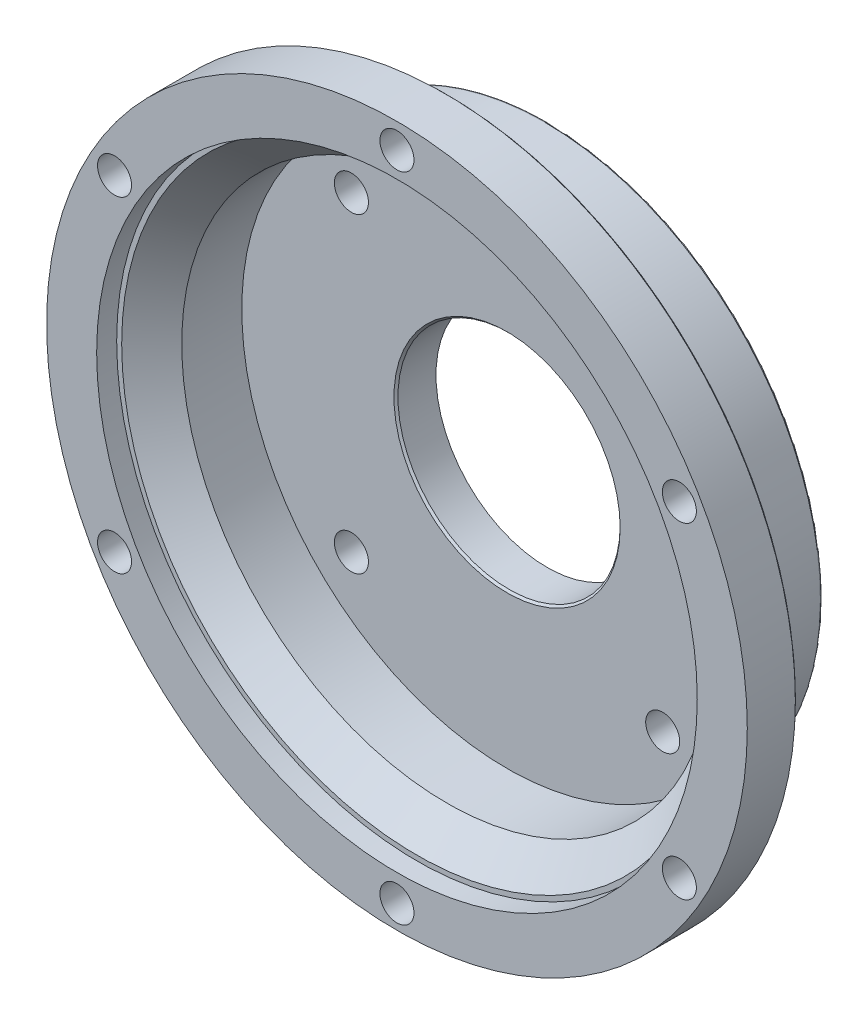
ISO-10303-21;
HEADER;
FILE_DESCRIPTION(('STEP AP214'),'2;1');
FILE_NAME('part.step','',(''),(''),'','','');
FILE_SCHEMA(('AUTOMOTIVE_DESIGN { 1 0 10303 214 1 1 1 1 }'));
ENDSEC;
DATA;
#1=APPLICATION_CONTEXT('core data for automotive mechanical design processes');
#2=APPLICATION_PROTOCOL_DEFINITION('international standard','automotive_design',2000,#1);
#3=PRODUCT_CONTEXT('',#1,'mechanical');
#4=PRODUCT('Part','Part','',(#3));
#5=PRODUCT_RELATED_PRODUCT_CATEGORY('part','',(#4));
#6=PRODUCT_DEFINITION_FORMATION('','',#4);
#7=PRODUCT_DEFINITION_CONTEXT('part definition',#1,'design');
#8=PRODUCT_DEFINITION('design','',#6,#7);
#9=PRODUCT_DEFINITION_SHAPE('','',#8);
#10=(LENGTH_UNIT() NAMED_UNIT(*) SI_UNIT(.MILLI.,.METRE.));
#11=(NAMED_UNIT(*) PLANE_ANGLE_UNIT() SI_UNIT($,.RADIAN.));
#12=(NAMED_UNIT(*) SI_UNIT($,.STERADIAN.) SOLID_ANGLE_UNIT());
#13=UNCERTAINTY_MEASURE_WITH_UNIT(LENGTH_MEASURE(1.E-05),#10,'distance_accuracy_value','');
#14=(GEOMETRIC_REPRESENTATION_CONTEXT(3) GLOBAL_UNCERTAINTY_ASSIGNED_CONTEXT((#13)) GLOBAL_UNIT_ASSIGNED_CONTEXT((#10,
#11,#12)) REPRESENTATION_CONTEXT('',''));
#15=CARTESIAN_POINT('',(0.,0.,0.));
#16=DIRECTION('',(0.,0.,1.));
#17=DIRECTION('',(1.,0.,0.));
#18=AXIS2_PLACEMENT_3D('',#15,#16,#17);
#19=CARTESIAN_POINT('',(-15.55,-15.55,2.99999999999999));
#20=DIRECTION('',(0.,0.,1.));
#21=DIRECTION('',(1.,0.,0.));
#22=AXIS2_PLACEMENT_3D('',#19,#20,#21);
#23=CYLINDRICAL_SURFACE('',#22,1.7);
#24=CARTESIAN_POINT('',(-15.55,-15.55,-10.));
#25=DIRECTION('',(0.,0.,1.));
#26=DIRECTION('',(1.,0.,0.));
#27=AXIS2_PLACEMENT_3D('',#24,#25,#26);
#28=CIRCLE('',#27,1.7);
#29=CARTESIAN_POINT('',(-13.85,-15.55,-10.));
#30=VERTEX_POINT('',#29);
#31=EDGE_CURVE('E106',#30,#30,#28,.T.);
#32=ORIENTED_EDGE('',*,*,#31,.F.);
#33=EDGE_LOOP('',(#32));
#34=FACE_BOUND('',#33,.T.);
#35=CARTESIAN_POINT('',(-15.55,-15.55,-6.00000000000001));
#36=DIRECTION('',(0.,0.,1.));
#37=DIRECTION('',(1.,0.,0.));
#38=AXIS2_PLACEMENT_3D('',#35,#36,#37);
#39=CIRCLE('',#38,1.7);
#40=CARTESIAN_POINT('',(-13.85,-15.55,-6.00000000000001));
#41=VERTEX_POINT('',#40);
#42=EDGE_CURVE('E136',#41,#41,#39,.F.);
#43=ORIENTED_EDGE('',*,*,#42,.F.);
#44=EDGE_LOOP('',(#43));
#45=FACE_BOUND('',#44,.T.);
#46=ADVANCED_FACE('F39',(#34,#45),#23,.F.);
#47=CARTESIAN_POINT('',(15.55,-15.55,2.99999999999999));
#48=DIRECTION('',(0.,0.,1.));
#49=DIRECTION('',(1.,0.,0.));
#50=AXIS2_PLACEMENT_3D('',#47,#48,#49);
#51=CYLINDRICAL_SURFACE('',#50,1.7);
#52=CARTESIAN_POINT('',(15.55,-15.55,-10.));
#53=DIRECTION('',(0.,0.,1.));
#54=DIRECTION('',(1.,0.,0.));
#55=AXIS2_PLACEMENT_3D('',#52,#53,#54);
#56=CIRCLE('',#55,1.7);
#57=CARTESIAN_POINT('',(17.25,-15.55,-10.));
#58=VERTEX_POINT('',#57);
#59=EDGE_CURVE('E111',#58,#58,#56,.T.);
#60=ORIENTED_EDGE('',*,*,#59,.F.);
#61=EDGE_LOOP('',(#60));
#62=FACE_BOUND('',#61,.T.);
#63=CARTESIAN_POINT('',(15.55,-15.55,-6.00000000000001));
#64=DIRECTION('',(0.,0.,1.));
#65=DIRECTION('',(1.,0.,0.));
#66=AXIS2_PLACEMENT_3D('',#63,#64,#65);
#67=CIRCLE('',#66,1.7);
#68=CARTESIAN_POINT('',(17.25,-15.55,-6.00000000000001));
#69=VERTEX_POINT('',#68);
#70=EDGE_CURVE('E138',#69,#69,#67,.F.);
#71=ORIENTED_EDGE('',*,*,#70,.F.);
#72=EDGE_LOOP('',(#71));
#73=FACE_BOUND('',#72,.T.);
#74=ADVANCED_FACE('F175',(#62,#73),#51,.F.);
#75=CARTESIAN_POINT('',(15.55,15.55,2.99999999999999));
#76=DIRECTION('',(0.,0.,1.));
#77=DIRECTION('',(1.,0.,0.));
#78=AXIS2_PLACEMENT_3D('',#75,#76,#77);
#79=CYLINDRICAL_SURFACE('',#78,1.7);
#80=CARTESIAN_POINT('',(15.55,15.55,-10.));
#81=DIRECTION('',(0.,0.,1.));
#82=DIRECTION('',(1.,0.,0.));
#83=AXIS2_PLACEMENT_3D('',#80,#81,#82);
#84=CIRCLE('',#83,1.7);
#85=CARTESIAN_POINT('',(17.25,15.55,-10.));
#86=VERTEX_POINT('',#85);
#87=EDGE_CURVE('E112',#86,#86,#84,.T.);
#88=ORIENTED_EDGE('',*,*,#87,.F.);
#89=EDGE_LOOP('',(#88));
#90=FACE_BOUND('',#89,.T.);
#91=CARTESIAN_POINT('',(15.55,15.55,-6.00000000000001));
#92=DIRECTION('',(0.,0.,1.));
#93=DIRECTION('',(1.,0.,0.));
#94=AXIS2_PLACEMENT_3D('',#91,#92,#93);
#95=CIRCLE('',#94,1.7);
#96=CARTESIAN_POINT('',(17.25,15.55,-6.00000000000001));
#97=VERTEX_POINT('',#96);
#98=EDGE_CURVE('E145',#97,#97,#95,.F.);
#99=ORIENTED_EDGE('',*,*,#98,.F.);
#100=EDGE_LOOP('',(#99));
#101=FACE_BOUND('',#100,.T.);
#102=ADVANCED_FACE('F177',(#90,#101),#79,.F.);
#103=CARTESIAN_POINT('',(-15.55,15.55,2.99999999999999));
#104=DIRECTION('',(0.,0.,1.));
#105=DIRECTION('',(1.,0.,0.));
#106=AXIS2_PLACEMENT_3D('',#103,#104,#105);
#107=CYLINDRICAL_SURFACE('',#106,1.7);
#108=CARTESIAN_POINT('',(-15.55,15.55,-10.));
#109=DIRECTION('',(0.,0.,1.));
#110=DIRECTION('',(1.,0.,0.));
#111=AXIS2_PLACEMENT_3D('',#108,#109,#110);
#112=CIRCLE('',#111,1.7);
#113=CARTESIAN_POINT('',(-13.85,15.55,-10.));
#114=VERTEX_POINT('',#113);
#115=EDGE_CURVE('E120',#114,#114,#112,.T.);
#116=ORIENTED_EDGE('',*,*,#115,.F.);
#117=EDGE_LOOP('',(#116));
#118=FACE_BOUND('',#117,.T.);
#119=CARTESIAN_POINT('',(-15.55,15.55,-6.00000000000001));
#120=DIRECTION('',(0.,0.,1.));
#121=DIRECTION('',(1.,0.,0.));
#122=AXIS2_PLACEMENT_3D('',#119,#120,#121);
#123=CIRCLE('',#122,1.7);
#124=CARTESIAN_POINT('',(-13.85,15.55,-6.00000000000001));
#125=VERTEX_POINT('',#124);
#126=EDGE_CURVE('E143',#125,#125,#123,.F.);
#127=ORIENTED_EDGE('',*,*,#126,.F.);
#128=EDGE_LOOP('',(#127));
#129=FACE_BOUND('',#128,.T.);
#130=ADVANCED_FACE('F226',(#118,#129),#107,.F.);
#131=CARTESIAN_POINT('',(0.,0.,-10.));
#132=DIRECTION('',(0.,0.,1.));
#133=DIRECTION('',(1.,0.,0.));
#134=AXIS2_PLACEMENT_3D('',#131,#132,#133);
#135=CYLINDRICAL_SURFACE('',#134,35.);
#136=CARTESIAN_POINT('',(0.,0.,0.200000000000006));
#137=DIRECTION('',(0.,0.,-1.));
#138=DIRECTION('',(-1.,0.,0.));
#139=AXIS2_PLACEMENT_3D('',#136,#137,#138);
#140=CIRCLE('',#139,35.);
#141=CARTESIAN_POINT('',(-35.,0.,0.200000000000006));
#142=VERTEX_POINT('',#141);
#143=EDGE_CURVE('E51',#142,#142,#140,.F.);
#144=ORIENTED_EDGE('',*,*,#143,.T.);
#145=EDGE_LOOP('',(#144));
#146=FACE_BOUND('',#145,.T.);
#147=CARTESIAN_POINT('',(0.,0.,4.99999999999999));
#148=DIRECTION('',(0.,0.,1.));
#149=DIRECTION('',(1.,0.,0.));
#150=AXIS2_PLACEMENT_3D('',#147,#148,#149);
#151=CIRCLE('',#150,35.);
#152=CARTESIAN_POINT('',(35.,0.,4.99999999999999));
#153=VERTEX_POINT('',#152);
#154=EDGE_CURVE('E81',#153,#153,#151,.T.);
#155=ORIENTED_EDGE('',*,*,#154,.F.);
#156=EDGE_LOOP('',(#155));
#157=FACE_BOUND('',#156,.T.);
#158=ADVANCED_FACE('F219',(#146,#157),#135,.T.);
#159=CARTESIAN_POINT('',(0.,32.5,4.99999999999999));
#160=DIRECTION('',(0.,0.,1.));
#161=DIRECTION('',(1.,0.,0.));
#162=AXIS2_PLACEMENT_3D('',#159,#160,#161);
#163=CYLINDRICAL_SURFACE('',#162,1.7);
#164=CARTESIAN_POINT('',(0.,32.5,4.99999999999999));
#165=DIRECTION('',(0.,0.,1.));
#166=DIRECTION('',(1.,0.,0.));
#167=AXIS2_PLACEMENT_3D('',#164,#165,#166);
#168=CIRCLE('',#167,1.7);
#169=CARTESIAN_POINT('',(1.7,32.5,4.99999999999999));
#170=VERTEX_POINT('',#169);
#171=EDGE_CURVE('E83',#170,#170,#168,.T.);
#172=ORIENTED_EDGE('',*,*,#171,.T.);
#173=EDGE_LOOP('',(#172));
#174=FACE_BOUND('',#173,.T.);
#175=CARTESIAN_POINT('',(0.,32.5,0.));
#176=DIRECTION('',(0.,0.,-1.));
#177=DIRECTION('',(-1.,0.,0.));
#178=AXIS2_PLACEMENT_3D('',#175,#176,#177);
#179=CIRCLE('',#178,1.7);
#180=CARTESIAN_POINT('',(-1.7,32.5,0.));
#181=VERTEX_POINT('',#180);
#182=EDGE_CURVE('E119',#181,#181,#179,.F.);
#183=ORIENTED_EDGE('',*,*,#182,.F.);
#184=EDGE_LOOP('',(#183));
#185=FACE_BOUND('',#184,.T.);
#186=ADVANCED_FACE('F213',(#174,#185),#163,.F.);
#187=CARTESIAN_POINT('',(-28.212383818288,16.2115726080303,4.99999999999999));
#188=DIRECTION('',(0.,0.,1.));
#189=DIRECTION('',(1.,0.,0.));
#190=AXIS2_PLACEMENT_3D('',#187,#188,#189);
#191=CYLINDRICAL_SURFACE('',#190,1.7);
#192=CARTESIAN_POINT('',(-28.212383818288,16.2115726080303,4.99999999999999));
#193=DIRECTION('',(0.,0.,1.));
#194=DIRECTION('',(1.,0.,0.));
#195=AXIS2_PLACEMENT_3D('',#192,#193,#194);
#196=CIRCLE('',#195,1.7);
#197=CARTESIAN_POINT('',(-26.5123838182881,16.2115726080303,4.99999999999999));
#198=VERTEX_POINT('',#197);
#199=EDGE_CURVE('E90',#198,#198,#196,.T.);
#200=ORIENTED_EDGE('',*,*,#199,.T.);
#201=EDGE_LOOP('',(#200));
#202=FACE_BOUND('',#201,.T.);
#203=CARTESIAN_POINT('',(-28.212383818288,16.2115726080303,0.));
#204=DIRECTION('',(0.,0.,-1.));
#205=DIRECTION('',(-1.,0.,0.));
#206=AXIS2_PLACEMENT_3D('',#203,#204,#205);
#207=CIRCLE('',#206,1.7);
#208=CARTESIAN_POINT('',(-29.912383818288,16.2115726080303,0.));
#209=VERTEX_POINT('',#208);
#210=EDGE_CURVE('E124',#209,#209,#207,.F.);
#211=ORIENTED_EDGE('',*,*,#210,.F.);
#212=EDGE_LOOP('',(#211));
#213=FACE_BOUND('',#212,.T.);
#214=ADVANCED_FACE('F208',(#202,#213),#191,.F.);
#215=CARTESIAN_POINT('',(-28.2123838182879,-16.365282175909,4.99999999999999));
#216=DIRECTION('',(0.,0.,1.));
#217=DIRECTION('',(1.,0.,0.));
#218=AXIS2_PLACEMENT_3D('',#215,#216,#217);
#219=CYLINDRICAL_SURFACE('',#218,1.7);
#220=CARTESIAN_POINT('',(-28.2123838182879,-16.365282175909,4.99999999999999));
#221=DIRECTION('',(0.,0.,1.));
#222=DIRECTION('',(1.,0.,0.));
#223=AXIS2_PLACEMENT_3D('',#220,#221,#222);
#224=CIRCLE('',#223,1.7);
#225=CARTESIAN_POINT('',(-26.5123838182879,-16.365282175909,4.99999999999999));
#226=VERTEX_POINT('',#225);
#227=EDGE_CURVE('E88',#226,#226,#224,.T.);
#228=ORIENTED_EDGE('',*,*,#227,.T.);
#229=EDGE_LOOP('',(#228));
#230=FACE_BOUND('',#229,.T.);
#231=CARTESIAN_POINT('',(-28.2123838182879,-16.365282175909,0.));
#232=DIRECTION('',(0.,0.,-1.));
#233=DIRECTION('',(-1.,0.,0.));
#234=AXIS2_PLACEMENT_3D('',#231,#232,#233);
#235=CIRCLE('',#234,1.7);
#236=CARTESIAN_POINT('',(-29.9123838182879,-16.365282175909,0.));
#237=VERTEX_POINT('',#236);
#238=EDGE_CURVE('E126',#237,#237,#235,.F.);
#239=ORIENTED_EDGE('',*,*,#238,.F.);
#240=EDGE_LOOP('',(#239));
#241=FACE_BOUND('',#240,.T.);
#242=ADVANCED_FACE('F207',(#230,#241),#219,.F.);
#243=CARTESIAN_POINT('',(0.,-32.6537095678785,4.99999999999999));
#244=DIRECTION('',(0.,0.,1.));
#245=DIRECTION('',(1.,0.,0.));
#246=AXIS2_PLACEMENT_3D('',#243,#244,#245);
#247=CYLINDRICAL_SURFACE('',#246,1.7);
#248=CARTESIAN_POINT('',(0.,-32.6537095678785,4.99999999999999));
#249=DIRECTION('',(0.,0.,1.));
#250=DIRECTION('',(1.,0.,0.));
#251=AXIS2_PLACEMENT_3D('',#248,#249,#250);
#252=CIRCLE('',#251,1.7);
#253=CARTESIAN_POINT('',(1.70000000000001,-32.6537095678785,4.99999999999999));
#254=VERTEX_POINT('',#253);
#255=EDGE_CURVE('E94',#254,#254,#252,.T.);
#256=ORIENTED_EDGE('',*,*,#255,.T.);
#257=EDGE_LOOP('',(#256));
#258=FACE_BOUND('',#257,.T.);
#259=CARTESIAN_POINT('',(0.,-32.6537095678785,0.));
#260=DIRECTION('',(0.,0.,-1.));
#261=DIRECTION('',(-1.,0.,0.));
#262=AXIS2_PLACEMENT_3D('',#259,#260,#261);
#263=CIRCLE('',#262,1.7);
#264=CARTESIAN_POINT('',(-1.69999999999998,-32.6537095678785,0.));
#265=VERTEX_POINT('',#264);
#266=EDGE_CURVE('E128',#265,#265,#263,.F.);
#267=ORIENTED_EDGE('',*,*,#266,.F.);
#268=EDGE_LOOP('',(#267));
#269=FACE_BOUND('',#268,.T.);
#270=ADVANCED_FACE('F202',(#258,#269),#247,.F.);
#271=CARTESIAN_POINT('',(28.2123838182882,-16.3652821759086,4.99999999999999));
#272=DIRECTION('',(0.,0.,1.));
#273=DIRECTION('',(1.,0.,0.));
#274=AXIS2_PLACEMENT_3D('',#271,#272,#273);
#275=CYLINDRICAL_SURFACE('',#274,1.7);
#276=CARTESIAN_POINT('',(28.2123838182882,-16.3652821759086,4.99999999999999));
#277=DIRECTION('',(0.,0.,1.));
#278=DIRECTION('',(1.,0.,0.));
#279=AXIS2_PLACEMENT_3D('',#276,#277,#278);
#280=CIRCLE('',#279,1.7);
#281=CARTESIAN_POINT('',(29.9123838182882,-16.3652821759086,4.99999999999999));
#282=VERTEX_POINT('',#281);
#283=EDGE_CURVE('E98',#282,#282,#280,.T.);
#284=ORIENTED_EDGE('',*,*,#283,.T.);
#285=EDGE_LOOP('',(#284));
#286=FACE_BOUND('',#285,.T.);
#287=CARTESIAN_POINT('',(28.2123838182882,-16.3652821759086,0.));
#288=DIRECTION('',(0.,0.,-1.));
#289=DIRECTION('',(-1.,0.,0.));
#290=AXIS2_PLACEMENT_3D('',#287,#288,#289);
#291=CIRCLE('',#290,1.7);
#292=CARTESIAN_POINT('',(26.5123838182882,-16.3652821759086,0.));
#293=VERTEX_POINT('',#292);
#294=EDGE_CURVE('E73',#293,#293,#291,.F.);
#295=ORIENTED_EDGE('',*,*,#294,.F.);
#296=EDGE_LOOP('',(#295));
#297=FACE_BOUND('',#296,.T.);
#298=ADVANCED_FACE('F199',(#286,#297),#275,.F.);
#299=CARTESIAN_POINT('',(28.2123838182878,16.2115726080307,4.99999999999999));
#300=DIRECTION('',(0.,0.,1.));
#301=DIRECTION('',(1.,0.,0.));
#302=AXIS2_PLACEMENT_3D('',#299,#300,#301);
#303=CYLINDRICAL_SURFACE('',#302,1.7);
#304=CARTESIAN_POINT('',(28.2123838182878,16.2115726080307,4.99999999999999));
#305=DIRECTION('',(0.,0.,1.));
#306=DIRECTION('',(1.,0.,0.));
#307=AXIS2_PLACEMENT_3D('',#304,#305,#306);
#308=CIRCLE('',#307,1.7);
#309=CARTESIAN_POINT('',(29.9123838182878,16.2115726080307,4.99999999999999));
#310=VERTEX_POINT('',#309);
#311=EDGE_CURVE('E100',#310,#310,#308,.T.);
#312=ORIENTED_EDGE('',*,*,#311,.T.);
#313=EDGE_LOOP('',(#312));
#314=FACE_BOUND('',#313,.T.);
#315=CARTESIAN_POINT('',(28.2123838182878,16.2115726080307,0.));
#316=DIRECTION('',(0.,0.,-1.));
#317=DIRECTION('',(-1.,0.,0.));
#318=AXIS2_PLACEMENT_3D('',#315,#316,#317);
#319=CIRCLE('',#318,1.7);
#320=CARTESIAN_POINT('',(26.5123838182878,16.2115726080307,0.));
#321=VERTEX_POINT('',#320);
#322=EDGE_CURVE('E71',#321,#321,#319,.F.);
#323=ORIENTED_EDGE('',*,*,#322,.F.);
#324=EDGE_LOOP('',(#323));
#325=FACE_BOUND('',#324,.T.);
#326=ADVANCED_FACE('F193',(#314,#325),#303,.F.);
#327=CARTESIAN_POINT('',(0.,0.,-10.));
#328=DIRECTION('',(0.,0.,1.));
#329=DIRECTION('',(1.,0.,0.));
#330=AXIS2_PLACEMENT_3D('',#327,#328,#329);
#331=PLANE('',#330);
#332=CARTESIAN_POINT('',(0.,0.,-10.));
#333=DIRECTION('',(0.,0.,1.));
#334=DIRECTION('',(1.,0.,0.));
#335=AXIS2_PLACEMENT_3D('',#332,#333,#334);
#336=CIRCLE('',#335,11.1);
#337=CARTESIAN_POINT('',(11.1,0.,-10.));
#338=VERTEX_POINT('',#337);
#339=EDGE_CURVE('E70',#338,#338,#336,.T.);
#340=ORIENTED_EDGE('',*,*,#339,.T.);
#341=EDGE_LOOP('',(#340));
#342=FACE_BOUND('',#341,.T.);
#343=CARTESIAN_POINT('',(0.,0.,-10.));
#344=DIRECTION('',(0.,0.,1.));
#345=DIRECTION('',(1.,0.,0.));
#346=AXIS2_PLACEMENT_3D('',#343,#344,#345);
#347=CIRCLE('',#346,27.3);
#348=CARTESIAN_POINT('',(27.3,0.,-10.));
#349=VERTEX_POINT('',#348);
#350=EDGE_CURVE('E76',#349,#349,#347,.F.);
#351=ORIENTED_EDGE('',*,*,#350,.T.);
#352=EDGE_LOOP('',(#351));
#353=FACE_BOUND('',#352,.T.);
#354=ORIENTED_EDGE('',*,*,#31,.T.);
#355=EDGE_LOOP('',(#354));
#356=FACE_BOUND('',#355,.T.);
#357=ORIENTED_EDGE('',*,*,#59,.T.);
#358=EDGE_LOOP('',(#357));
#359=FACE_BOUND('',#358,.T.);
#360=ORIENTED_EDGE('',*,*,#87,.T.);
#361=EDGE_LOOP('',(#360));
#362=FACE_BOUND('',#361,.T.);
#363=ORIENTED_EDGE('',*,*,#115,.T.);
#364=EDGE_LOOP('',(#363));
#365=FACE_BOUND('',#364,.T.);
#366=ADVANCED_FACE('F200',(#342,#353,#356,#359,#362,#365),#331,.F.);
#367=CARTESIAN_POINT('',(0.,0.,4.99999999999999));
#368=DIRECTION('',(0.,0.,1.));
#369=DIRECTION('',(1.,0.,0.));
#370=AXIS2_PLACEMENT_3D('',#367,#368,#369);
#371=PLANE('',#370);
#372=CARTESIAN_POINT('',(0.,0.,4.99999999999999));
#373=DIRECTION('',(0.,0.,1.));
#374=DIRECTION('',(1.,0.,0.));
#375=AXIS2_PLACEMENT_3D('',#372,#373,#374);
#376=CIRCLE('',#375,30.);
#377=CARTESIAN_POINT('',(30.,0.,4.99999999999999));
#378=VERTEX_POINT('',#377);
#379=EDGE_CURVE('E101',#378,#378,#376,.T.);
#380=ORIENTED_EDGE('',*,*,#379,.F.);
#381=EDGE_LOOP('',(#380));
#382=FACE_BOUND('',#381,.T.);
#383=ORIENTED_EDGE('',*,*,#311,.F.);
#384=EDGE_LOOP('',(#383));
#385=FACE_BOUND('',#384,.T.);
#386=ORIENTED_EDGE('',*,*,#283,.F.);
#387=EDGE_LOOP('',(#386));
#388=FACE_BOUND('',#387,.T.);
#389=ORIENTED_EDGE('',*,*,#255,.F.);
#390=EDGE_LOOP('',(#389));
#391=FACE_BOUND('',#390,.T.);
#392=ORIENTED_EDGE('',*,*,#227,.F.);
#393=EDGE_LOOP('',(#392));
#394=FACE_BOUND('',#393,.T.);
#395=ORIENTED_EDGE('',*,*,#199,.F.);
#396=EDGE_LOOP('',(#395));
#397=FACE_BOUND('',#396,.T.);
#398=ORIENTED_EDGE('',*,*,#171,.F.);
#399=EDGE_LOOP('',(#398));
#400=FACE_BOUND('',#399,.T.);
#401=ORIENTED_EDGE('',*,*,#154,.T.);
#402=EDGE_LOOP('',(#401));
#403=FACE_BOUND('',#402,.T.);
#404=ADVANCED_FACE('F192',(#382,#385,#388,#391,#394,#397,#400,#403),#371,.T.);
#405=CARTESIAN_POINT('',(0.,0.,2.99999999999999));
#406=DIRECTION('',(0.,0.,1.));
#407=DIRECTION('',(1.,0.,0.));
#408=AXIS2_PLACEMENT_3D('',#405,#406,#407);
#409=CYLINDRICAL_SURFACE('',#408,30.);
#410=CARTESIAN_POINT('',(0.,0.,2.99999999999999));
#411=DIRECTION('',(0.,0.,1.));
#412=DIRECTION('',(1.,0.,0.));
#413=AXIS2_PLACEMENT_3D('',#410,#411,#412);
#414=CIRCLE('',#413,30.);
#415=CARTESIAN_POINT('',(30.,0.,2.99999999999999));
#416=VERTEX_POINT('',#415);
#417=EDGE_CURVE('E105',#416,#416,#414,.T.);
#418=ORIENTED_EDGE('',*,*,#417,.F.);
#419=EDGE_LOOP('',(#418));
#420=FACE_BOUND('',#419,.T.);
#421=ORIENTED_EDGE('',*,*,#379,.T.);
#422=EDGE_LOOP('',(#421));
#423=FACE_BOUND('',#422,.T.);
#424=ADVANCED_FACE('F186',(#420,#423),#409,.F.);
#425=CARTESIAN_POINT('',(0.,0.,2.99999999999999));
#426=DIRECTION('',(0.,0.,1.));
#427=DIRECTION('',(1.,0.,0.));
#428=AXIS2_PLACEMENT_3D('',#425,#426,#427);
#429=PLANE('',#428);
#430=CARTESIAN_POINT('',(0.,0.,2.99999999999999));
#431=DIRECTION('',(0.,0.,1.));
#432=DIRECTION('',(1.,0.,0.));
#433=AXIS2_PLACEMENT_3D('',#430,#431,#432);
#434=CIRCLE('',#433,29.5);
#435=CARTESIAN_POINT('',(29.5,0.,2.99999999999999));
#436=VERTEX_POINT('',#435);
#437=EDGE_CURVE('E10',#436,#436,#434,.F.);
#438=ORIENTED_EDGE('',*,*,#437,.T.);
#439=EDGE_LOOP('',(#438));
#440=FACE_BOUND('',#439,.T.);
#441=ORIENTED_EDGE('',*,*,#417,.T.);
#442=EDGE_LOOP('',(#441));
#443=FACE_BOUND('',#442,.T.);
#444=ADVANCED_FACE('F187',(#440,#443),#429,.T.);
#445=CARTESIAN_POINT('',(0.,0.,-6.));
#446=DIRECTION('',(0.,0.,-1.));
#447=DIRECTION('',(-1.,0.,0.));
#448=AXIS2_PLACEMENT_3D('',#445,#446,#447);
#449=CYLINDRICAL_SURFACE('',#448,27.5);
#450=CARTESIAN_POINT('',(0.,0.,-9.8));
#451=DIRECTION('',(0.,0.,1.));
#452=DIRECTION('',(1.,0.,0.));
#453=AXIS2_PLACEMENT_3D('',#450,#451,#452);
#454=CIRCLE('',#453,27.5);
#455=CARTESIAN_POINT('',(27.5,0.,-9.8));
#456=VERTEX_POINT('',#455);
#457=EDGE_CURVE('E67',#456,#456,#454,.T.);
#458=ORIENTED_EDGE('',*,*,#457,.T.);
#459=EDGE_LOOP('',(#458));
#460=FACE_BOUND('',#459,.T.);
#461=CARTESIAN_POINT('',(0.,0.,0.));
#462=DIRECTION('',(0.,0.,-1.));
#463=DIRECTION('',(-1.,0.,0.));
#464=AXIS2_PLACEMENT_3D('',#461,#462,#463);
#465=CIRCLE('',#464,27.5);
#466=CARTESIAN_POINT('',(-27.5,0.,0.));
#467=VERTEX_POINT('',#466);
#468=EDGE_CURVE('E75',#467,#467,#465,.T.);
#469=ORIENTED_EDGE('',*,*,#468,.T.);
#470=EDGE_LOOP('',(#469));
#471=FACE_BOUND('',#470,.T.);
#472=ADVANCED_FACE('F189',(#460,#471),#449,.T.);
#473=CARTESIAN_POINT('',(0.,0.,-9.8));
#474=DIRECTION('',(0.,0.,1.));
#475=DIRECTION('',(1.,0.,0.));
#476=AXIS2_PLACEMENT_3D('',#473,#474,#475);
#477=TOROIDAL_SURFACE('',#476,27.3,0.2);
#478=ORIENTED_EDGE('',*,*,#457,.F.);
#479=EDGE_LOOP('',(#478));
#480=FACE_BOUND('',#479,.T.);
#481=ORIENTED_EDGE('',*,*,#350,.F.);
#482=EDGE_LOOP('',(#481));
#483=FACE_BOUND('',#482,.T.);
#484=ADVANCED_FACE('F229',(#480,#483),#477,.T.);
#485=CARTESIAN_POINT('',(0.,0.,0.));
#486=DIRECTION('',(0.,0.,-1.));
#487=DIRECTION('',(-1.,0.,0.));
#488=AXIS2_PLACEMENT_3D('',#485,#486,#487);
#489=PLANE('',#488);
#490=CARTESIAN_POINT('',(0.,0.,0.));
#491=DIRECTION('',(0.,0.,-1.));
#492=DIRECTION('',(-1.,0.,0.));
#493=AXIS2_PLACEMENT_3D('',#490,#491,#492);
#494=CIRCLE('',#493,34.8);
#495=CARTESIAN_POINT('',(-34.8,0.,0.));
#496=VERTEX_POINT('',#495);
#497=EDGE_CURVE('E54',#496,#496,#494,.T.);
#498=ORIENTED_EDGE('',*,*,#497,.T.);
#499=EDGE_LOOP('',(#498));
#500=FACE_BOUND('',#499,.T.);
#501=ORIENTED_EDGE('',*,*,#468,.F.);
#502=EDGE_LOOP('',(#501));
#503=FACE_BOUND('',#502,.T.);
#504=ORIENTED_EDGE('',*,*,#322,.T.);
#505=EDGE_LOOP('',(#504));
#506=FACE_BOUND('',#505,.T.);
#507=ORIENTED_EDGE('',*,*,#294,.T.);
#508=EDGE_LOOP('',(#507));
#509=FACE_BOUND('',#508,.T.);
#510=ORIENTED_EDGE('',*,*,#266,.T.);
#511=EDGE_LOOP('',(#510));
#512=FACE_BOUND('',#511,.T.);
#513=ORIENTED_EDGE('',*,*,#238,.T.);
#514=EDGE_LOOP('',(#513));
#515=FACE_BOUND('',#514,.T.);
#516=ORIENTED_EDGE('',*,*,#210,.T.);
#517=EDGE_LOOP('',(#516));
#518=FACE_BOUND('',#517,.T.);
#519=ORIENTED_EDGE('',*,*,#182,.T.);
#520=EDGE_LOOP('',(#519));
#521=FACE_BOUND('',#520,.T.);
#522=ADVANCED_FACE('F170',(#500,#503,#506,#509,#512,#515,#518,#521),#489,.T.);
#523=CARTESIAN_POINT('',(0.,0.,-6.00000000000001));
#524=DIRECTION('',(0.,0.,1.));
#525=DIRECTION('',(1.,0.,0.));
#526=AXIS2_PLACEMENT_3D('',#523,#524,#525);
#527=PLANE('',#526);
#528=CARTESIAN_POINT('',(0.,0.,-6.00000000000001));
#529=DIRECTION('',(0.,0.,1.));
#530=DIRECTION('',(1.,0.,0.));
#531=AXIS2_PLACEMENT_3D('',#528,#529,#530);
#532=CIRCLE('',#531,11.3);
#533=CARTESIAN_POINT('',(11.3,0.,-6.00000000000001));
#534=VERTEX_POINT('',#533);
#535=EDGE_CURVE('E64',#534,#534,#532,.F.);
#536=ORIENTED_EDGE('',*,*,#535,.T.);
#537=EDGE_LOOP('',(#536));
#538=FACE_BOUND('',#537,.T.);
#539=CARTESIAN_POINT('',(0.,0.,-6.00000000000001));
#540=DIRECTION('',(0.,0.,1.));
#541=DIRECTION('',(1.,0.,0.));
#542=AXIS2_PLACEMENT_3D('',#539,#540,#541);
#543=CIRCLE('',#542,26.5);
#544=CARTESIAN_POINT('',(26.5,0.,-6.00000000000001));
#545=VERTEX_POINT('',#544);
#546=EDGE_CURVE('E68',#545,#545,#543,.T.);
#547=ORIENTED_EDGE('',*,*,#546,.T.);
#548=EDGE_LOOP('',(#547));
#549=FACE_BOUND('',#548,.T.);
#550=ORIENTED_EDGE('',*,*,#126,.T.);
#551=EDGE_LOOP('',(#550));
#552=FACE_BOUND('',#551,.T.);
#553=ORIENTED_EDGE('',*,*,#98,.T.);
#554=EDGE_LOOP('',(#553));
#555=FACE_BOUND('',#554,.T.);
#556=ORIENTED_EDGE('',*,*,#70,.T.);
#557=EDGE_LOOP('',(#556));
#558=FACE_BOUND('',#557,.T.);
#559=ORIENTED_EDGE('',*,*,#42,.T.);
#560=EDGE_LOOP('',(#559));
#561=FACE_BOUND('',#560,.T.);
#562=ADVANCED_FACE('F152',(#538,#549,#552,#555,#558,#561),#527,.T.);
#563=CARTESIAN_POINT('',(0.,0.,-6.00000000000001));
#564=DIRECTION('',(0.,0.,1.));
#565=DIRECTION('',(1.,0.,0.));
#566=AXIS2_PLACEMENT_3D('',#563,#564,#565);
#567=CYLINDRICAL_SURFACE('',#566,26.5);
#568=CARTESIAN_POINT('',(0.,0.,0.));
#569=DIRECTION('',(0.,0.,1.));
#570=DIRECTION('',(1.,0.,0.));
#571=AXIS2_PLACEMENT_3D('',#568,#569,#570);
#572=CIRCLE('',#571,26.5);
#573=CARTESIAN_POINT('',(26.5,0.,0.));
#574=VERTEX_POINT('',#573);
#575=EDGE_CURVE('E50',#574,#574,#572,.T.);
#576=ORIENTED_EDGE('',*,*,#575,.T.);
#577=EDGE_LOOP('',(#576));
#578=FACE_BOUND('',#577,.T.);
#579=ORIENTED_EDGE('',*,*,#546,.F.);
#580=EDGE_LOOP('',(#579));
#581=FACE_BOUND('',#580,.T.);
#582=ADVANCED_FACE('F151',(#578,#581),#567,.F.);
#583=CARTESIAN_POINT('',(0.,0.,-7.00000000000001));
#584=DIRECTION('',(0.,0.,1.));
#585=DIRECTION('',(1.,0.,0.));
#586=AXIS2_PLACEMENT_3D('',#583,#584,#585);
#587=CYLINDRICAL_SURFACE('',#586,11.1);
#588=CARTESIAN_POINT('',(0.,0.,-6.20000000000004));
#589=DIRECTION('',(0.,0.,1.));
#590=DIRECTION('',(1.,0.,0.));
#591=AXIS2_PLACEMENT_3D('',#588,#589,#590);
#592=CIRCLE('',#591,11.1);
#593=CARTESIAN_POINT('',(11.1,0.,-6.20000000000004));
#594=VERTEX_POINT('',#593);
#595=EDGE_CURVE('E58',#594,#594,#592,.T.);
#596=ORIENTED_EDGE('',*,*,#595,.T.);
#597=EDGE_LOOP('',(#596));
#598=FACE_BOUND('',#597,.T.);
#599=ORIENTED_EDGE('',*,*,#339,.F.);
#600=EDGE_LOOP('',(#599));
#601=FACE_BOUND('',#600,.T.);
#602=ADVANCED_FACE('F156',(#598,#601),#587,.F.);
#603=CARTESIAN_POINT('',(0.,0.,-6.00000000000001));
#604=DIRECTION('',(0.,0.,1.));
#605=DIRECTION('',(1.,0.,0.));
#606=AXIS2_PLACEMENT_3D('',#603,#604,#605);
#607=CONICAL_SURFACE('',#606,11.3,0.785398163397422);
#608=ORIENTED_EDGE('',*,*,#595,.F.);
#609=EDGE_LOOP('',(#608));
#610=FACE_BOUND('',#609,.T.);
#611=ORIENTED_EDGE('',*,*,#535,.F.);
#612=EDGE_LOOP('',(#611));
#613=FACE_BOUND('',#612,.T.);
#614=ADVANCED_FACE('F161',(#610,#613),#607,.F.);
#615=CARTESIAN_POINT('',(0.,0.,0.));
#616=DIRECTION('',(0.,0.,1.));
#617=DIRECTION('',(1.,0.,0.));
#618=AXIS2_PLACEMENT_3D('',#615,#616,#617);
#619=CONICAL_SURFACE('',#618,34.8,0.785398163397431);
#620=ORIENTED_EDGE('',*,*,#143,.F.);
#621=EDGE_LOOP('',(#620));
#622=FACE_BOUND('',#621,.T.);
#623=ORIENTED_EDGE('',*,*,#497,.F.);
#624=EDGE_LOOP('',(#623));
#625=FACE_BOUND('',#624,.T.);
#626=ADVANCED_FACE('F237',(#622,#625),#619,.T.);
#627=CARTESIAN_POINT('',(0.,0.,0.));
#628=DIRECTION('',(0.,0.,1.));
#629=DIRECTION('',(1.,0.,0.));
#630=AXIS2_PLACEMENT_3D('',#627,#628,#629);
#631=CONICAL_SURFACE('',#630,26.5,0.78539816339745);
#632=ORIENTED_EDGE('',*,*,#437,.F.);
#633=EDGE_LOOP('',(#632));
#634=FACE_BOUND('',#633,.T.);
#635=ORIENTED_EDGE('',*,*,#575,.F.);
#636=EDGE_LOOP('',(#635));
#637=FACE_BOUND('',#636,.T.);
#638=ADVANCED_FACE('F45',(#634,#637),#631,.F.);
#639=CLOSED_SHELL('',(#46,#74,#102,#130,#158,#186,#214,#242,#270,#298,#326,#366,#404,#424,#444,
#472,#484,#522,#562,#582,#602,#614,#626,#638));
#640=MANIFOLD_SOLID_BREP('B2',#639);
#641=ADVANCED_BREP_SHAPE_REPRESENTATION('',(#18,#640),#14);
#642=SHAPE_DEFINITION_REPRESENTATION(#9,#641);
ENDSEC;
END-ISO-10303-21;
